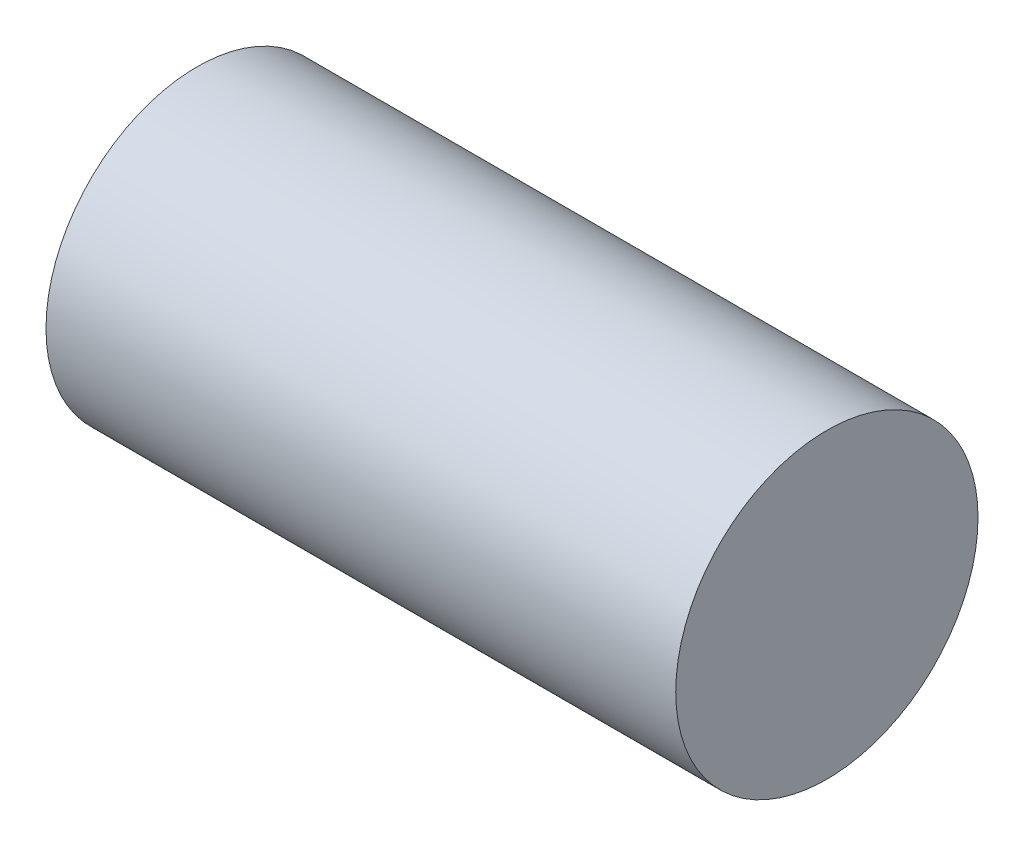
ISO-10303-21;
HEADER;
FILE_DESCRIPTION(('STEP AP214'),'2;1');
FILE_NAME('part.step','',(''),(''),'','','');
FILE_SCHEMA(('AUTOMOTIVE_DESIGN { 1 0 10303 214 1 1 1 1 }'));
ENDSEC;
DATA;
#1=APPLICATION_CONTEXT('core data for automotive mechanical design processes');
#2=APPLICATION_PROTOCOL_DEFINITION('international standard','automotive_design',2000,#1);
#3=PRODUCT_CONTEXT('',#1,'mechanical');
#4=PRODUCT('Part','Part','',(#3));
#5=PRODUCT_RELATED_PRODUCT_CATEGORY('part','',(#4));
#6=PRODUCT_DEFINITION_FORMATION('','',#4);
#7=PRODUCT_DEFINITION_CONTEXT('part definition',#1,'design');
#8=PRODUCT_DEFINITION('design','',#6,#7);
#9=PRODUCT_DEFINITION_SHAPE('','',#8);
#10=(LENGTH_UNIT() NAMED_UNIT(*) SI_UNIT(.MILLI.,.METRE.));
#11=(NAMED_UNIT(*) PLANE_ANGLE_UNIT() SI_UNIT($,.RADIAN.));
#12=(NAMED_UNIT(*) SI_UNIT($,.STERADIAN.) SOLID_ANGLE_UNIT());
#13=UNCERTAINTY_MEASURE_WITH_UNIT(LENGTH_MEASURE(1.E-05),#10,'distance_accuracy_value','');
#14=(GEOMETRIC_REPRESENTATION_CONTEXT(3) GLOBAL_UNCERTAINTY_ASSIGNED_CONTEXT((#13)) GLOBAL_UNIT_ASSIGNED_CONTEXT((#10,
#11,#12)) REPRESENTATION_CONTEXT('',''));
#15=CARTESIAN_POINT('',(0.,0.,0.));
#16=DIRECTION('',(0.,0.,1.));
#17=DIRECTION('',(1.,0.,0.));
#18=AXIS2_PLACEMENT_3D('',#15,#16,#17);
#19=CARTESIAN_POINT('',(0.,0.,0.));
#20=DIRECTION('',(1.,0.,0.));
#21=DIRECTION('',(0.,0.,-1.));
#22=AXIS2_PLACEMENT_3D('',#19,#20,#21);
#23=PLANE('',#22);
#24=CARTESIAN_POINT('',(0.,0.,0.));
#25=DIRECTION('',(1.,0.,0.));
#26=DIRECTION('',(0.,0.,-1.));
#27=AXIS2_PLACEMENT_3D('',#24,#25,#26);
#28=CIRCLE('',#27,6.35);
#29=CARTESIAN_POINT('',(0.,0.,-6.35));
#30=VERTEX_POINT('',#29);
#31=EDGE_CURVE('E37',#30,#30,#28,.F.);
#32=ORIENTED_EDGE('',*,*,#31,.F.);
#33=EDGE_LOOP('',(#32));
#34=FACE_BOUND('',#33,.T.);
#35=CARTESIAN_POINT('',(0.,0.,0.));
#36=DIRECTION('',(-1.,0.,0.));
#37=DIRECTION('',(0.,0.,1.));
#38=AXIS2_PLACEMENT_3D('',#35,#36,#37);
#39=CIRCLE('',#38,12.);
#40=CARTESIAN_POINT('',(0.,0.,12.));
#41=VERTEX_POINT('',#40);
#42=EDGE_CURVE('E10',#41,#41,#39,.T.);
#43=ORIENTED_EDGE('',*,*,#42,.T.);
#44=EDGE_LOOP('',(#43));
#45=FACE_BOUND('',#44,.T.);
#46=ADVANCED_FACE('F40',(#34,#45),#23,.F.);
#47=CARTESIAN_POINT('',(-1000.,0.,0.));
#48=DIRECTION('',(-1.,0.,0.));
#49=DIRECTION('',(0.,0.,1.));
#50=AXIS2_PLACEMENT_3D('',#47,#48,#49);
#51=CYLINDRICAL_SURFACE('',#50,12.);
#52=ORIENTED_EDGE('',*,*,#42,.F.);
#53=EDGE_LOOP('',(#52));
#54=FACE_BOUND('',#53,.T.);
#55=CARTESIAN_POINT('',(50.,0.,0.));
#56=DIRECTION('',(-1.,0.,0.));
#57=DIRECTION('',(0.,0.,1.));
#58=AXIS2_PLACEMENT_3D('',#55,#56,#57);
#59=CIRCLE('',#58,12.);
#60=CARTESIAN_POINT('',(50.,0.,12.));
#61=VERTEX_POINT('',#60);
#62=EDGE_CURVE('E42',#61,#61,#59,.T.);
#63=ORIENTED_EDGE('',*,*,#62,.T.);
#64=EDGE_LOOP('',(#63));
#65=FACE_BOUND('',#64,.T.);
#66=ADVANCED_FACE('F58',(#54,#65),#51,.T.);
#67=CARTESIAN_POINT('',(50.,12.,0.));
#68=DIRECTION('',(-1.,0.,0.));
#69=DIRECTION('',(0.,0.,1.));
#70=AXIS2_PLACEMENT_3D('',#67,#68,#69);
#71=PLANE('',#70);
#72=ORIENTED_EDGE('',*,*,#62,.F.);
#73=EDGE_LOOP('',(#72));
#74=FACE_BOUND('',#73,.T.);
#75=ADVANCED_FACE('F67',(#74),#71,.F.);
#76=CARTESIAN_POINT('',(-1000.,0.,0.));
#77=DIRECTION('',(-1.,0.,0.));
#78=DIRECTION('',(0.,0.,1.));
#79=AXIS2_PLACEMENT_3D('',#76,#77,#78);
#80=CYLINDRICAL_SURFACE('',#79,6.35);
#81=CARTESIAN_POINT('',(22.8999999999999,0.,0.));
#82=DIRECTION('',(-1.,0.,0.));
#83=DIRECTION('',(0.,0.,1.));
#84=AXIS2_PLACEMENT_3D('',#81,#82,#83);
#85=CIRCLE('',#84,6.35);
#86=CARTESIAN_POINT('',(22.8999999999999,0.,6.35));
#87=VERTEX_POINT('',#86);
#88=EDGE_CURVE('E49',#87,#87,#85,.T.);
#89=ORIENTED_EDGE('',*,*,#88,.F.);
#90=EDGE_LOOP('',(#89));
#91=FACE_BOUND('',#90,.T.);
#92=ORIENTED_EDGE('',*,*,#31,.T.);
#93=EDGE_LOOP('',(#92));
#94=FACE_BOUND('',#93,.T.);
#95=ADVANCED_FACE('F60',(#91,#94),#80,.F.);
#96=CARTESIAN_POINT('',(22.9,6.35,0.));
#97=DIRECTION('',(-1.,0.,0.));
#98=DIRECTION('',(0.,0.,1.));
#99=AXIS2_PLACEMENT_3D('',#96,#97,#98);
#100=PLANE('',#99);
#101=ORIENTED_EDGE('',*,*,#88,.T.);
#102=EDGE_LOOP('',(#101));
#103=FACE_BOUND('',#102,.T.);
#104=ADVANCED_FACE('F73',(#103),#100,.T.);
#105=CLOSED_SHELL('',(#46,#66,#75,#95,#104));
#106=MANIFOLD_SOLID_BREP('B2',#105);
#107=ADVANCED_BREP_SHAPE_REPRESENTATION('',(#18,#106),#14);
#108=SHAPE_DEFINITION_REPRESENTATION(#9,#107);
ENDSEC;
END-ISO-10303-21;
